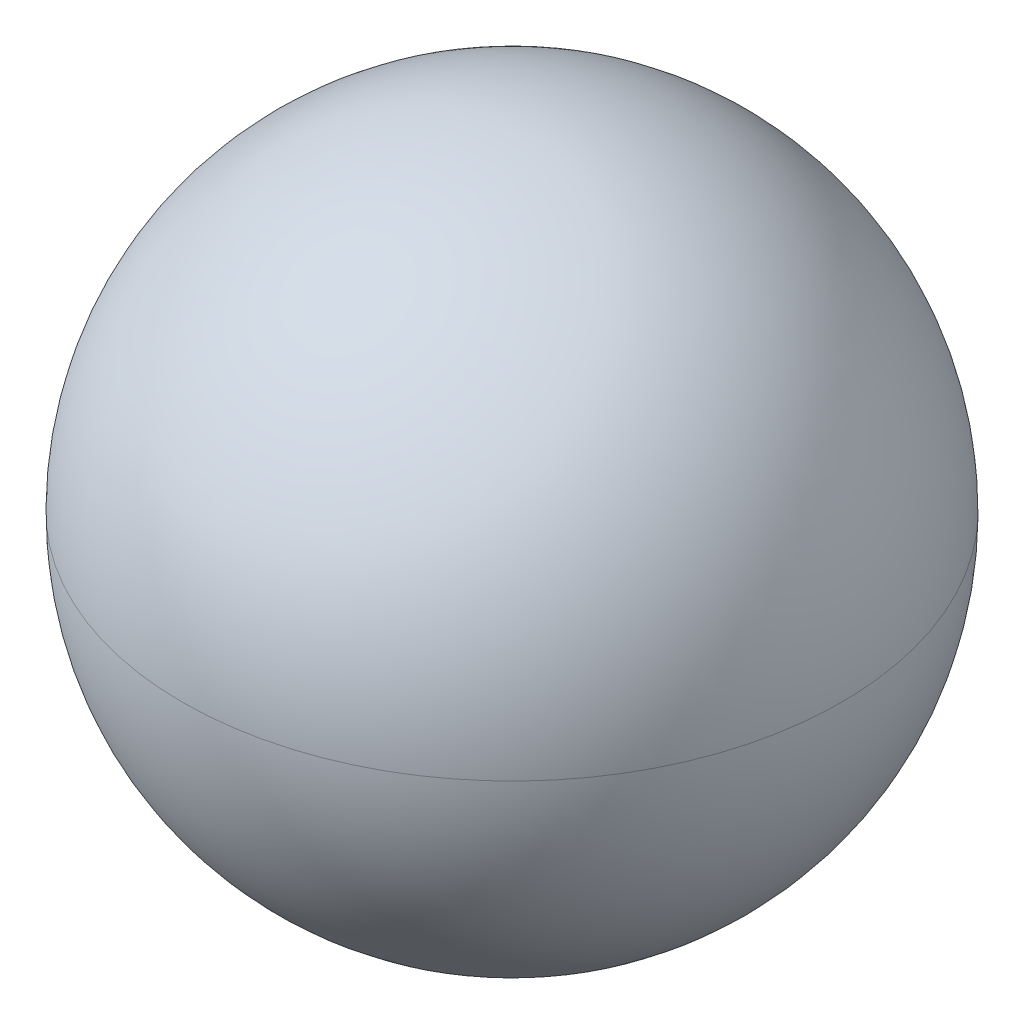
ISO-10303-21;
HEADER;
FILE_DESCRIPTION(('STEP AP214'),'2;1');
FILE_NAME('part.step','',(''),(''),'','','');
FILE_SCHEMA(('AUTOMOTIVE_DESIGN { 1 0 10303 214 1 1 1 1 }'));
ENDSEC;
DATA;
#1=APPLICATION_CONTEXT('core data for automotive mechanical design processes');
#2=APPLICATION_PROTOCOL_DEFINITION('international standard','automotive_design',2000,#1);
#3=PRODUCT_CONTEXT('',#1,'mechanical');
#4=PRODUCT('Part','Part','',(#3));
#5=PRODUCT_RELATED_PRODUCT_CATEGORY('part','',(#4));
#6=PRODUCT_DEFINITION_FORMATION('','',#4);
#7=PRODUCT_DEFINITION_CONTEXT('part definition',#1,'design');
#8=PRODUCT_DEFINITION('design','',#6,#7);
#9=PRODUCT_DEFINITION_SHAPE('','',#8);
#10=(LENGTH_UNIT() NAMED_UNIT(*) SI_UNIT(.MILLI.,.METRE.));
#11=(NAMED_UNIT(*) PLANE_ANGLE_UNIT() SI_UNIT($,.RADIAN.));
#12=(NAMED_UNIT(*) SI_UNIT($,.STERADIAN.) SOLID_ANGLE_UNIT());
#13=UNCERTAINTY_MEASURE_WITH_UNIT(LENGTH_MEASURE(1.E-05),#10,'distance_accuracy_value','');
#14=(GEOMETRIC_REPRESENTATION_CONTEXT(3) GLOBAL_UNCERTAINTY_ASSIGNED_CONTEXT((#13)) GLOBAL_UNIT_ASSIGNED_CONTEXT((#10,
#11,#12)) REPRESENTATION_CONTEXT('',''));
#15=CARTESIAN_POINT('',(0.,0.,0.));
#16=DIRECTION('',(0.,0.,1.));
#17=DIRECTION('',(1.,0.,0.));
#18=AXIS2_PLACEMENT_3D('',#15,#16,#17);
#19=CARTESIAN_POINT('',(0.,274.32,0.));
#20=DIRECTION('',(0.,1.,0.));
#21=DIRECTION('',(0.,0.,1.));
#22=AXIS2_PLACEMENT_3D('',#19,#20,#21);
#23=SPHERICAL_SURFACE('',#22,274.32);
#24=CARTESIAN_POINT('',(0.,274.32,0.));
#25=DIRECTION('',(0.,-1.,0.));
#26=DIRECTION('',(0.,0.,-1.));
#27=AXIS2_PLACEMENT_3D('',#24,#25,#26);
#28=CIRCLE('',#27,274.32);
#29=CARTESIAN_POINT('',(0.,274.32,-274.32));
#30=VERTEX_POINT('',#29);
#31=EDGE_CURVE('E45',#30,#30,#28,.T.);
#32=ORIENTED_EDGE('',*,*,#31,.F.);
#33=EDGE_LOOP('',(#32));
#34=FACE_BOUND('',#33,.T.);
#35=ADVANCED_FACE('F37',(#34),#23,.T.);
#36=CARTESIAN_POINT('',(0.,274.32,0.));
#37=DIRECTION('',(0.,1.,0.));
#38=DIRECTION('',(0.,0.,1.));
#39=AXIS2_PLACEMENT_3D('',#36,#37,#38);
#40=SPHERICAL_SURFACE('',#39,274.32);
#41=ORIENTED_EDGE('',*,*,#31,.T.);
#42=EDGE_LOOP('',(#41));
#43=FACE_BOUND('',#42,.T.);
#44=ADVANCED_FACE('F51',(#43),#40,.T.);
#45=CLOSED_SHELL('',(#35,#44));
#46=CARTESIAN_POINT('',(0.,274.32,0.));
#47=DIRECTION('',(0.,1.,0.));
#48=DIRECTION('',(0.,0.,1.));
#49=AXIS2_PLACEMENT_3D('',#46,#47,#48);
#50=SPHERICAL_SURFACE('',#49,271.145);
#51=CARTESIAN_POINT('',(0.,274.32,0.));
#52=DIRECTION('',(0.,1.,0.));
#53=DIRECTION('',(0.,0.,1.));
#54=AXIS2_PLACEMENT_3D('',#51,#52,#53);
#55=CIRCLE('',#54,271.145);
#56=CARTESIAN_POINT('',(0.,274.32,271.145));
#57=VERTEX_POINT('',#56);
#58=EDGE_CURVE('E10',#57,#57,#55,.F.);
#59=ORIENTED_EDGE('',*,*,#58,.T.);
#60=EDGE_LOOP('',(#59));
#61=FACE_BOUND('',#60,.T.);
#62=ADVANCED_FACE('F59',(#61),#50,.F.);
#63=CARTESIAN_POINT('',(0.,274.32,0.));
#64=DIRECTION('',(0.,1.,0.));
#65=DIRECTION('',(0.,0.,1.));
#66=AXIS2_PLACEMENT_3D('',#63,#64,#65);
#67=SPHERICAL_SURFACE('',#66,271.145);
#68=ORIENTED_EDGE('',*,*,#58,.F.);
#69=EDGE_LOOP('',(#68));
#70=FACE_BOUND('',#69,.T.);
#71=ADVANCED_FACE('F39',(#70),#67,.F.);
#72=CLOSED_SHELL('',(#62,#71));
#73=ORIENTED_CLOSED_SHELL('',*,#72,.T.);
#74=BREP_WITH_VOIDS('B2',#45,(#73));
#75=ADVANCED_BREP_SHAPE_REPRESENTATION('',(#18,#74),#14);
#76=SHAPE_DEFINITION_REPRESENTATION(#9,#75);
ENDSEC;
END-ISO-10303-21;
